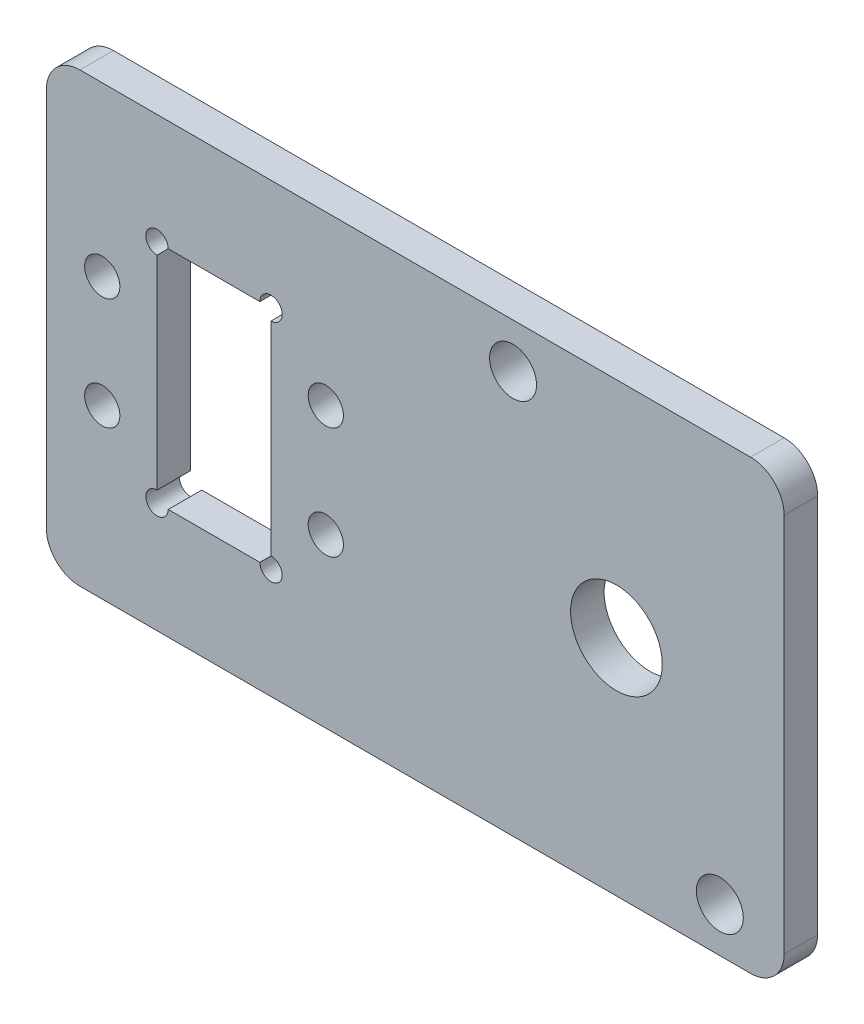
ISO-10303-21;
HEADER;
FILE_DESCRIPTION(('STEP AP214'),'2;1');
FILE_NAME('part.step','',(''),(''),'','','');
FILE_SCHEMA(('AUTOMOTIVE_DESIGN { 1 0 10303 214 1 1 1 1 }'));
ENDSEC;
DATA;
#1=APPLICATION_CONTEXT('core data for automotive mechanical design processes');
#2=APPLICATION_PROTOCOL_DEFINITION('international standard','automotive_design',2000,#1);
#3=PRODUCT_CONTEXT('',#1,'mechanical');
#4=PRODUCT('Part','Part','',(#3));
#5=PRODUCT_RELATED_PRODUCT_CATEGORY('part','',(#4));
#6=PRODUCT_DEFINITION_FORMATION('','',#4);
#7=PRODUCT_DEFINITION_CONTEXT('part definition',#1,'design');
#8=PRODUCT_DEFINITION('design','',#6,#7);
#9=PRODUCT_DEFINITION_SHAPE('','',#8);
#10=(LENGTH_UNIT() NAMED_UNIT(*) SI_UNIT(.MILLI.,.METRE.));
#11=(NAMED_UNIT(*) PLANE_ANGLE_UNIT() SI_UNIT($,.RADIAN.));
#12=(NAMED_UNIT(*) SI_UNIT($,.STERADIAN.) SOLID_ANGLE_UNIT());
#13=UNCERTAINTY_MEASURE_WITH_UNIT(LENGTH_MEASURE(1.E-05),#10,'distance_accuracy_value','');
#14=(GEOMETRIC_REPRESENTATION_CONTEXT(3) GLOBAL_UNCERTAINTY_ASSIGNED_CONTEXT((#13)) GLOBAL_UNIT_ASSIGNED_CONTEXT((#10,
#11,#12)) REPRESENTATION_CONTEXT('',''));
#15=CARTESIAN_POINT('',(0.,0.,0.));
#16=DIRECTION('',(0.,0.,1.));
#17=DIRECTION('',(1.,0.,0.));
#18=AXIS2_PLACEMENT_3D('',#15,#16,#17);
#19=CARTESIAN_POINT('',(0.,0.,3.));
#20=DIRECTION('',(-1.,0.,0.));
#21=DIRECTION('',(0.,-1.,0.));
#22=AXIS2_PLACEMENT_3D('',#19,#20,#21);
#23=PLANE('',#22);
#24=DIRECTION('',(0.,1.,0.));
#25=VECTOR('',#24,1.);
#26=CARTESIAN_POINT('',(0.,0.,3.));
#27=LINE('',#26,#25);
#28=CARTESIAN_POINT('',(0.,-37.,3.));
#29=VERTEX_POINT('',#28);
#30=CARTESIAN_POINT('',(0.,-3.,3.));
#31=VERTEX_POINT('',#30);
#32=EDGE_CURVE('E203',#29,#31,#27,.T.);
#33=ORIENTED_EDGE('',*,*,#32,.F.);
#34=DIRECTION('',(0.,0.,-1.));
#35=VECTOR('',#34,1.);
#36=CARTESIAN_POINT('',(0.,-37.,3.));
#37=LINE('',#36,#35);
#38=CARTESIAN_POINT('',(0.,-37.,0.));
#39=VERTEX_POINT('',#38);
#40=EDGE_CURVE('E11',#29,#39,#37,.T.);
#41=ORIENTED_EDGE('',*,*,#40,.T.);
#42=DIRECTION('',(0.,1.,0.));
#43=VECTOR('',#42,1.);
#44=CARTESIAN_POINT('',(0.,0.,0.));
#45=LINE('',#44,#43);
#46=CARTESIAN_POINT('',(0.,-3.,0.));
#47=VERTEX_POINT('',#46);
#48=EDGE_CURVE('E218',#39,#47,#45,.T.);
#49=ORIENTED_EDGE('',*,*,#48,.T.);
#50=DIRECTION('',(0.,0.,-1.));
#51=VECTOR('',#50,1.);
#52=CARTESIAN_POINT('',(0.,-3.,3.));
#53=LINE('',#52,#51);
#54=EDGE_CURVE('E52',#47,#31,#53,.F.);
#55=ORIENTED_EDGE('',*,*,#54,.T.);
#56=EDGE_LOOP('',(#33,#41,#49,#55));
#57=FACE_BOUND('',#56,.T.);
#58=ADVANCED_FACE('F43',(#57),#23,.F.);
#59=CARTESIAN_POINT('',(0.,0.,3.));
#60=DIRECTION('',(0.,-1.,0.));
#61=DIRECTION('',(1.,0.,0.));
#62=AXIS2_PLACEMENT_3D('',#59,#60,#61);
#63=PLANE('',#62);
#64=DIRECTION('',(-1.,0.,0.));
#65=VECTOR('',#64,1.);
#66=CARTESIAN_POINT('',(0.,0.,0.));
#67=LINE('',#66,#65);
#68=CARTESIAN_POINT('',(-3.,0.,0.));
#69=VERTEX_POINT('',#68);
#70=CARTESIAN_POINT('',(-63.,0.,0.));
#71=VERTEX_POINT('',#70);
#72=EDGE_CURVE('E222',#69,#71,#67,.T.);
#73=ORIENTED_EDGE('',*,*,#72,.T.);
#74=DIRECTION('',(0.,0.,-1.));
#75=VECTOR('',#74,1.);
#76=CARTESIAN_POINT('',(-63.,0.,3.));
#77=LINE('',#76,#75);
#78=CARTESIAN_POINT('',(-63.,0.,3.));
#79=VERTEX_POINT('',#78);
#80=EDGE_CURVE('E269',#71,#79,#77,.F.);
#81=ORIENTED_EDGE('',*,*,#80,.T.);
#82=DIRECTION('',(-1.,0.,0.));
#83=VECTOR('',#82,1.);
#84=CARTESIAN_POINT('',(0.,0.,3.));
#85=LINE('',#84,#83);
#86=CARTESIAN_POINT('',(-3.,0.,3.));
#87=VERTEX_POINT('',#86);
#88=EDGE_CURVE('E207',#87,#79,#85,.T.);
#89=ORIENTED_EDGE('',*,*,#88,.F.);
#90=DIRECTION('',(0.,0.,-1.));
#91=VECTOR('',#90,1.);
#92=CARTESIAN_POINT('',(-3.,0.,3.));
#93=LINE('',#92,#91);
#94=EDGE_CURVE('E265',#87,#69,#93,.T.);
#95=ORIENTED_EDGE('',*,*,#94,.T.);
#96=EDGE_LOOP('',(#73,#81,#89,#95));
#97=FACE_BOUND('',#96,.T.);
#98=ADVANCED_FACE('F301',(#97),#63,.F.);
#99=CARTESIAN_POINT('',(-66.,0.,3.));
#100=DIRECTION('',(1.,0.,0.));
#101=DIRECTION('',(0.,0.,-1.));
#102=AXIS2_PLACEMENT_3D('',#99,#100,#101);
#103=PLANE('',#102);
#104=DIRECTION('',(0.,-1.,0.));
#105=VECTOR('',#104,1.);
#106=CARTESIAN_POINT('',(-66.,0.,3.));
#107=LINE('',#106,#105);
#108=CARTESIAN_POINT('',(-66.,-3.00000000000001,3.));
#109=VERTEX_POINT('',#108);
#110=CARTESIAN_POINT('',(-66.,-37.,3.));
#111=VERTEX_POINT('',#110);
#112=EDGE_CURVE('E212',#109,#111,#107,.T.);
#113=ORIENTED_EDGE('',*,*,#112,.F.);
#114=DIRECTION('',(0.,0.,-1.));
#115=VECTOR('',#114,1.);
#116=CARTESIAN_POINT('',(-66.,-3.00000000000001,3.));
#117=LINE('',#116,#115);
#118=CARTESIAN_POINT('',(-66.,-3.00000000000001,0.));
#119=VERTEX_POINT('',#118);
#120=EDGE_CURVE('E249',#109,#119,#117,.T.);
#121=ORIENTED_EDGE('',*,*,#120,.T.);
#122=DIRECTION('',(0.,-1.,0.));
#123=VECTOR('',#122,1.);
#124=CARTESIAN_POINT('',(-66.,0.,0.));
#125=LINE('',#124,#123);
#126=CARTESIAN_POINT('',(-66.,-37.,0.));
#127=VERTEX_POINT('',#126);
#128=EDGE_CURVE('E227',#119,#127,#125,.T.);
#129=ORIENTED_EDGE('',*,*,#128,.T.);
#130=DIRECTION('',(0.,0.,-1.));
#131=VECTOR('',#130,1.);
#132=CARTESIAN_POINT('',(-66.,-37.,3.));
#133=LINE('',#132,#131);
#134=EDGE_CURVE('E246',#127,#111,#133,.F.);
#135=ORIENTED_EDGE('',*,*,#134,.T.);
#136=EDGE_LOOP('',(#113,#121,#129,#135));
#137=FACE_BOUND('',#136,.T.);
#138=ADVANCED_FACE('F312',(#137),#103,.F.);
#139=CARTESIAN_POINT('',(-66.,-40.,3.));
#140=DIRECTION('',(0.,1.,0.));
#141=DIRECTION('',(0.,0.,1.));
#142=AXIS2_PLACEMENT_3D('',#139,#140,#141);
#143=PLANE('',#142);
#144=DIRECTION('',(1.,0.,0.));
#145=VECTOR('',#144,1.);
#146=CARTESIAN_POINT('',(-66.,-40.,3.));
#147=LINE('',#146,#145);
#148=CARTESIAN_POINT('',(-63.,-40.,3.));
#149=VERTEX_POINT('',#148);
#150=CARTESIAN_POINT('',(-3.,-40.,3.));
#151=VERTEX_POINT('',#150);
#152=EDGE_CURVE('E215',#149,#151,#147,.T.);
#153=ORIENTED_EDGE('',*,*,#152,.F.);
#154=DIRECTION('',(0.,0.,-1.));
#155=VECTOR('',#154,1.);
#156=CARTESIAN_POINT('',(-63.,-40.,3.));
#157=LINE('',#156,#155);
#158=CARTESIAN_POINT('',(-63.,-40.,0.));
#159=VERTEX_POINT('',#158);
#160=EDGE_CURVE('E285',#149,#159,#157,.T.);
#161=ORIENTED_EDGE('',*,*,#160,.T.);
#162=DIRECTION('',(1.,0.,0.));
#163=VECTOR('',#162,1.);
#164=CARTESIAN_POINT('',(-66.,-40.,0.));
#165=LINE('',#164,#163);
#166=CARTESIAN_POINT('',(-3.,-40.,0.));
#167=VERTEX_POINT('',#166);
#168=EDGE_CURVE('E208',#159,#167,#165,.T.);
#169=ORIENTED_EDGE('',*,*,#168,.T.);
#170=DIRECTION('',(0.,0.,-1.));
#171=VECTOR('',#170,1.);
#172=CARTESIAN_POINT('',(-3.,-40.,3.));
#173=LINE('',#172,#171);
#174=EDGE_CURVE('E59',#167,#151,#173,.F.);
#175=ORIENTED_EDGE('',*,*,#174,.T.);
#176=EDGE_LOOP('',(#153,#161,#169,#175));
#177=FACE_BOUND('',#176,.T.);
#178=ADVANCED_FACE('F318',(#177),#143,.F.);
#179=CARTESIAN_POINT('',(0.,0.,3.));
#180=DIRECTION('',(0.,0.,1.));
#181=DIRECTION('',(1.,0.,0.));
#182=AXIS2_PLACEMENT_3D('',#179,#180,#181);
#183=PLANE('',#182);
#184=CARTESIAN_POINT('',(-56.1,-9.9,3.));
#185=DIRECTION('',(0.,0.,1.));
#186=DIRECTION('',(1.,0.,0.));
#187=AXIS2_PLACEMENT_3D('',#184,#185,#186);
#188=CIRCLE('',#187,0.999999999999998);
#189=CARTESIAN_POINT('',(-55.1,-9.9,3.));
#190=VERTEX_POINT('',#189);
#191=CARTESIAN_POINT('',(-56.1,-10.9,3.));
#192=VERTEX_POINT('',#191);
#193=EDGE_CURVE('E701',#190,#192,#188,.T.);
#194=ORIENTED_EDGE('',*,*,#193,.F.);
#195=DIRECTION('',(-1.,0.,0.));
#196=VECTOR('',#195,1.);
#197=CARTESIAN_POINT('',(-56.1,-9.9,3.));
#198=LINE('',#197,#196);
#199=CARTESIAN_POINT('',(-46.9,-9.9,3.));
#200=VERTEX_POINT('',#199);
#201=EDGE_CURVE('E191',#200,#190,#198,.T.);
#202=ORIENTED_EDGE('',*,*,#201,.F.);
#203=CARTESIAN_POINT('',(-45.9,-9.9,3.));
#204=DIRECTION('',(0.,0.,1.));
#205=DIRECTION('',(1.,0.,0.));
#206=AXIS2_PLACEMENT_3D('',#203,#204,#205);
#207=CIRCLE('',#206,0.999999999999998);
#208=CARTESIAN_POINT('',(-45.9,-10.9,3.));
#209=VERTEX_POINT('',#208);
#210=EDGE_CURVE('E170',#209,#200,#207,.T.);
#211=ORIENTED_EDGE('',*,*,#210,.F.);
#212=DIRECTION('',(0.,1.,0.));
#213=VECTOR('',#212,1.);
#214=CARTESIAN_POINT('',(-45.9,-9.9,3.));
#215=LINE('',#214,#213);
#216=CARTESIAN_POINT('',(-45.9,-29.1,3.));
#217=VERTEX_POINT('',#216);
#218=EDGE_CURVE('E178',#217,#209,#215,.T.);
#219=ORIENTED_EDGE('',*,*,#218,.F.);
#220=CARTESIAN_POINT('',(-45.9,-30.1,3.));
#221=DIRECTION('',(0.,0.,1.));
#222=DIRECTION('',(1.,0.,0.));
#223=AXIS2_PLACEMENT_3D('',#220,#221,#222);
#224=CIRCLE('',#223,0.999999999999998);
#225=CARTESIAN_POINT('',(-46.9,-30.1,3.));
#226=VERTEX_POINT('',#225);
#227=EDGE_CURVE('E158',#226,#217,#224,.T.);
#228=ORIENTED_EDGE('',*,*,#227,.F.);
#229=DIRECTION('',(1.,0.,0.));
#230=VECTOR('',#229,1.);
#231=CARTESIAN_POINT('',(-56.1,-30.1,3.));
#232=LINE('',#231,#230);
#233=CARTESIAN_POINT('',(-55.1,-30.1,3.));
#234=VERTEX_POINT('',#233);
#235=EDGE_CURVE('E192',#234,#226,#232,.T.);
#236=ORIENTED_EDGE('',*,*,#235,.F.);
#237=CARTESIAN_POINT('',(-56.1,-30.1,3.));
#238=DIRECTION('',(0.,0.,1.));
#239=DIRECTION('',(1.,0.,0.));
#240=AXIS2_PLACEMENT_3D('',#237,#238,#239);
#241=CIRCLE('',#240,0.999999999999998);
#242=CARTESIAN_POINT('',(-56.1,-29.1,3.));
#243=VERTEX_POINT('',#242);
#244=EDGE_CURVE('E597',#243,#234,#241,.T.);
#245=ORIENTED_EDGE('',*,*,#244,.F.);
#246=DIRECTION('',(0.,-1.,0.));
#247=VECTOR('',#246,1.);
#248=CARTESIAN_POINT('',(-56.1,-9.9,3.));
#249=LINE('',#248,#247);
#250=EDGE_CURVE('E199',#192,#243,#249,.T.);
#251=ORIENTED_EDGE('',*,*,#250,.F.);
#252=EDGE_LOOP('',(#194,#202,#211,#219,#228,#236,#245,#251));
#253=FACE_BOUND('',#252,.T.);
#254=CARTESIAN_POINT('',(-5.74999999999992,-36.0214699700121,3.));
#255=DIRECTION('',(0.,0.,1.));
#256=DIRECTION('',(1.,0.,0.));
#257=AXIS2_PLACEMENT_3D('',#254,#255,#256);
#258=CIRCLE('',#257,2.1);
#259=CARTESIAN_POINT('',(-3.64999999999992,-36.0214699700121,3.));
#260=VERTEX_POINT('',#259);
#261=EDGE_CURVE('E676',#260,#260,#258,.T.);
#262=ORIENTED_EDGE('',*,*,#261,.F.);
#263=EDGE_LOOP('',(#262));
#264=FACE_BOUND('',#263,.T.);
#265=CARTESIAN_POINT('',(-24.2500000000001,-3.97853002998793,3.));
#266=DIRECTION('',(0.,0.,1.));
#267=DIRECTION('',(1.,0.,0.));
#268=AXIS2_PLACEMENT_3D('',#265,#266,#267);
#269=CIRCLE('',#268,2.1);
#270=CARTESIAN_POINT('',(-22.1500000000001,-3.97853002998793,3.));
#271=VERTEX_POINT('',#270);
#272=EDGE_CURVE('E668',#271,#271,#269,.T.);
#273=ORIENTED_EDGE('',*,*,#272,.F.);
#274=EDGE_LOOP('',(#273));
#275=FACE_BOUND('',#274,.T.);
#276=CARTESIAN_POINT('',(-15.,-20.,3.));
#277=DIRECTION('',(0.,0.,1.));
#278=DIRECTION('',(1.,0.,0.));
#279=AXIS2_PLACEMENT_3D('',#276,#277,#278);
#280=CIRCLE('',#279,4.1);
#281=CARTESIAN_POINT('',(-10.9,-20.,3.));
#282=VERTEX_POINT('',#281);
#283=EDGE_CURVE('E660',#282,#282,#280,.T.);
#284=ORIENTED_EDGE('',*,*,#283,.F.);
#285=EDGE_LOOP('',(#284));
#286=FACE_BOUND('',#285,.T.);
#287=CARTESIAN_POINT('',(-41.,-15.,3.));
#288=DIRECTION('',(0.,0.,1.));
#289=DIRECTION('',(-1.,0.,0.));
#290=AXIS2_PLACEMENT_3D('',#287,#288,#289);
#291=CIRCLE('',#290,1.57500000000001);
#292=CARTESIAN_POINT('',(-42.575,-15.,3.));
#293=VERTEX_POINT('',#292);
#294=EDGE_CURVE('E652',#293,#293,#291,.T.);
#295=ORIENTED_EDGE('',*,*,#294,.F.);
#296=EDGE_LOOP('',(#295));
#297=FACE_BOUND('',#296,.T.);
#298=CARTESIAN_POINT('',(-41.,-25.,3.));
#299=DIRECTION('',(0.,0.,1.));
#300=DIRECTION('',(1.,0.,0.));
#301=AXIS2_PLACEMENT_3D('',#298,#299,#300);
#302=CIRCLE('',#301,1.57500000000001);
#303=CARTESIAN_POINT('',(-39.425,-25.,3.));
#304=VERTEX_POINT('',#303);
#305=EDGE_CURVE('E644',#304,#304,#302,.T.);
#306=ORIENTED_EDGE('',*,*,#305,.F.);
#307=EDGE_LOOP('',(#306));
#308=FACE_BOUND('',#307,.T.);
#309=CARTESIAN_POINT('',(-61.,-25.,3.));
#310=DIRECTION('',(0.,0.,1.));
#311=DIRECTION('',(-1.,0.,0.));
#312=AXIS2_PLACEMENT_3D('',#309,#310,#311);
#313=CIRCLE('',#312,1.57500000000001);
#314=CARTESIAN_POINT('',(-62.575,-25.,3.));
#315=VERTEX_POINT('',#314);
#316=EDGE_CURVE('E631',#315,#315,#313,.T.);
#317=ORIENTED_EDGE('',*,*,#316,.F.);
#318=EDGE_LOOP('',(#317));
#319=FACE_BOUND('',#318,.T.);
#320=CARTESIAN_POINT('',(-61.,-15.,3.));
#321=DIRECTION('',(0.,0.,1.));
#322=DIRECTION('',(1.,0.,0.));
#323=AXIS2_PLACEMENT_3D('',#320,#321,#322);
#324=CIRCLE('',#323,1.57500000000001);
#325=CARTESIAN_POINT('',(-59.425,-15.,3.));
#326=VERTEX_POINT('',#325);
#327=EDGE_CURVE('E621',#326,#326,#324,.T.);
#328=ORIENTED_EDGE('',*,*,#327,.F.);
#329=EDGE_LOOP('',(#328));
#330=FACE_BOUND('',#329,.T.);
#331=ORIENTED_EDGE('',*,*,#88,.T.);
#332=CARTESIAN_POINT('',(-63.,-3.00000000000001,3.));
#333=DIRECTION('',(0.,0.,1.));
#334=DIRECTION('',(1.,0.,0.));
#335=AXIS2_PLACEMENT_3D('',#332,#333,#334);
#336=CIRCLE('',#335,3.);
#337=EDGE_CURVE('E280',#79,#109,#336,.T.);
#338=ORIENTED_EDGE('',*,*,#337,.T.);
#339=ORIENTED_EDGE('',*,*,#112,.T.);
#340=CARTESIAN_POINT('',(-63.,-37.,3.));
#341=DIRECTION('',(0.,0.,1.));
#342=DIRECTION('',(1.,0.,0.));
#343=AXIS2_PLACEMENT_3D('',#340,#341,#342);
#344=CIRCLE('',#343,3.);
#345=EDGE_CURVE('E66',#111,#149,#344,.T.);
#346=ORIENTED_EDGE('',*,*,#345,.T.);
#347=ORIENTED_EDGE('',*,*,#152,.T.);
#348=CARTESIAN_POINT('',(-3.,-37.,3.));
#349=DIRECTION('',(0.,0.,1.));
#350=DIRECTION('',(1.,0.,0.));
#351=AXIS2_PLACEMENT_3D('',#348,#349,#350);
#352=CIRCLE('',#351,3.);
#353=EDGE_CURVE('E275',#151,#29,#352,.T.);
#354=ORIENTED_EDGE('',*,*,#353,.T.);
#355=ORIENTED_EDGE('',*,*,#32,.T.);
#356=CARTESIAN_POINT('',(-3.,-3.,3.));
#357=DIRECTION('',(0.,0.,1.));
#358=DIRECTION('',(1.,0.,0.));
#359=AXIS2_PLACEMENT_3D('',#356,#357,#358);
#360=CIRCLE('',#359,3.);
#361=EDGE_CURVE('E272',#31,#87,#360,.T.);
#362=ORIENTED_EDGE('',*,*,#361,.T.);
#363=EDGE_LOOP('',(#331,#338,#339,#346,#347,#354,#355,#362));
#364=FACE_BOUND('',#363,.T.);
#365=ADVANCED_FACE('F187',(#253,#264,#275,#286,#297,#308,#319,#330,#364),#183,.T.);
#366=CARTESIAN_POINT('',(0.,0.,0.));
#367=DIRECTION('',(0.,0.,1.));
#368=DIRECTION('',(1.,0.,0.));
#369=AXIS2_PLACEMENT_3D('',#366,#367,#368);
#370=PLANE('',#369);
#371=CARTESIAN_POINT('',(-5.74999999999992,-36.0214699700121,0.));
#372=DIRECTION('',(0.,0.,1.));
#373=DIRECTION('',(1.,0.,0.));
#374=AXIS2_PLACEMENT_3D('',#371,#372,#373);
#375=CIRCLE('',#374,2.1);
#376=CARTESIAN_POINT('',(-3.64999999999992,-36.0214699700121,0.));
#377=VERTEX_POINT('',#376);
#378=EDGE_CURVE('E679',#377,#377,#375,.T.);
#379=ORIENTED_EDGE('',*,*,#378,.T.);
#380=EDGE_LOOP('',(#379));
#381=FACE_BOUND('',#380,.T.);
#382=CARTESIAN_POINT('',(-24.2500000000001,-3.97853002998793,0.));
#383=DIRECTION('',(0.,0.,1.));
#384=DIRECTION('',(1.,0.,0.));
#385=AXIS2_PLACEMENT_3D('',#382,#383,#384);
#386=CIRCLE('',#385,2.1);
#387=CARTESIAN_POINT('',(-22.1500000000001,-3.97853002998793,0.));
#388=VERTEX_POINT('',#387);
#389=EDGE_CURVE('E672',#388,#388,#386,.T.);
#390=ORIENTED_EDGE('',*,*,#389,.T.);
#391=EDGE_LOOP('',(#390));
#392=FACE_BOUND('',#391,.T.);
#393=CARTESIAN_POINT('',(-15.,-20.,0.));
#394=DIRECTION('',(0.,0.,1.));
#395=DIRECTION('',(1.,0.,0.));
#396=AXIS2_PLACEMENT_3D('',#393,#394,#395);
#397=CIRCLE('',#396,4.1);
#398=CARTESIAN_POINT('',(-10.9,-20.,0.));
#399=VERTEX_POINT('',#398);
#400=EDGE_CURVE('E664',#399,#399,#397,.T.);
#401=ORIENTED_EDGE('',*,*,#400,.T.);
#402=EDGE_LOOP('',(#401));
#403=FACE_BOUND('',#402,.T.);
#404=CARTESIAN_POINT('',(-41.,-15.,0.));
#405=DIRECTION('',(0.,0.,1.));
#406=DIRECTION('',(-1.,0.,0.));
#407=AXIS2_PLACEMENT_3D('',#404,#405,#406);
#408=CIRCLE('',#407,1.57500000000001);
#409=CARTESIAN_POINT('',(-42.575,-15.,0.));
#410=VERTEX_POINT('',#409);
#411=EDGE_CURVE('E656',#410,#410,#408,.T.);
#412=ORIENTED_EDGE('',*,*,#411,.T.);
#413=EDGE_LOOP('',(#412));
#414=FACE_BOUND('',#413,.T.);
#415=CARTESIAN_POINT('',(-41.,-25.,0.));
#416=DIRECTION('',(0.,0.,1.));
#417=DIRECTION('',(1.,0.,0.));
#418=AXIS2_PLACEMENT_3D('',#415,#416,#417);
#419=CIRCLE('',#418,1.57500000000001);
#420=CARTESIAN_POINT('',(-39.425,-25.,0.));
#421=VERTEX_POINT('',#420);
#422=EDGE_CURVE('E648',#421,#421,#419,.T.);
#423=ORIENTED_EDGE('',*,*,#422,.T.);
#424=EDGE_LOOP('',(#423));
#425=FACE_BOUND('',#424,.T.);
#426=CARTESIAN_POINT('',(-61.,-25.,0.));
#427=DIRECTION('',(0.,0.,1.));
#428=DIRECTION('',(-1.,0.,0.));
#429=AXIS2_PLACEMENT_3D('',#426,#427,#428);
#430=CIRCLE('',#429,1.57500000000001);
#431=CARTESIAN_POINT('',(-62.575,-25.,0.));
#432=VERTEX_POINT('',#431);
#433=EDGE_CURVE('E640',#432,#432,#430,.T.);
#434=ORIENTED_EDGE('',*,*,#433,.T.);
#435=EDGE_LOOP('',(#434));
#436=FACE_BOUND('',#435,.T.);
#437=CARTESIAN_POINT('',(-61.,-15.,0.));
#438=DIRECTION('',(0.,0.,1.));
#439=DIRECTION('',(1.,0.,0.));
#440=AXIS2_PLACEMENT_3D('',#437,#438,#439);
#441=CIRCLE('',#440,1.57500000000001);
#442=CARTESIAN_POINT('',(-59.425,-15.,0.));
#443=VERTEX_POINT('',#442);
#444=EDGE_CURVE('E625',#443,#443,#441,.T.);
#445=ORIENTED_EDGE('',*,*,#444,.T.);
#446=EDGE_LOOP('',(#445));
#447=FACE_BOUND('',#446,.T.);
#448=DIRECTION('',(-1.,0.,0.));
#449=VECTOR('',#448,1.);
#450=CARTESIAN_POINT('',(-56.1,-9.9,0.));
#451=LINE('',#450,#449);
#452=CARTESIAN_POINT('',(-46.9,-9.9,0.));
#453=VERTEX_POINT('',#452);
#454=CARTESIAN_POINT('',(-55.1,-9.9,0.));
#455=VERTEX_POINT('',#454);
#456=EDGE_CURVE('E223',#453,#455,#451,.T.);
#457=ORIENTED_EDGE('',*,*,#456,.T.);
#458=CARTESIAN_POINT('',(-56.1,-9.9,0.));
#459=DIRECTION('',(0.,0.,1.));
#460=DIRECTION('',(1.,0.,0.));
#461=AXIS2_PLACEMENT_3D('',#458,#459,#460);
#462=CIRCLE('',#461,0.999999999999998);
#463=CARTESIAN_POINT('',(-56.1,-10.9,0.));
#464=VERTEX_POINT('',#463);
#465=EDGE_CURVE('E697',#455,#464,#462,.T.);
#466=ORIENTED_EDGE('',*,*,#465,.T.);
#467=DIRECTION('',(0.,-1.,0.));
#468=VECTOR('',#467,1.);
#469=CARTESIAN_POINT('',(-56.1,-9.9,0.));
#470=LINE('',#469,#468);
#471=CARTESIAN_POINT('',(-56.1,-29.1,0.));
#472=VERTEX_POINT('',#471);
#473=EDGE_CURVE('E197',#464,#472,#470,.T.);
#474=ORIENTED_EDGE('',*,*,#473,.T.);
#475=CARTESIAN_POINT('',(-56.1,-30.1,0.));
#476=DIRECTION('',(0.,0.,1.));
#477=DIRECTION('',(1.,0.,0.));
#478=AXIS2_PLACEMENT_3D('',#475,#476,#477);
#479=CIRCLE('',#478,0.999999999999998);
#480=CARTESIAN_POINT('',(-55.1,-30.1,0.));
#481=VERTEX_POINT('',#480);
#482=EDGE_CURVE('E603',#472,#481,#479,.T.);
#483=ORIENTED_EDGE('',*,*,#482,.T.);
#484=DIRECTION('',(1.,0.,0.));
#485=VECTOR('',#484,1.);
#486=CARTESIAN_POINT('',(-56.1,-30.1,0.));
#487=LINE('',#486,#485);
#488=CARTESIAN_POINT('',(-46.9,-30.1,0.));
#489=VERTEX_POINT('',#488);
#490=EDGE_CURVE('E607',#481,#489,#487,.T.);
#491=ORIENTED_EDGE('',*,*,#490,.T.);
#492=CARTESIAN_POINT('',(-45.9,-30.1,0.));
#493=DIRECTION('',(0.,0.,1.));
#494=DIRECTION('',(1.,0.,0.));
#495=AXIS2_PLACEMENT_3D('',#492,#493,#494);
#496=CIRCLE('',#495,0.999999999999998);
#497=CARTESIAN_POINT('',(-45.9,-29.1,0.));
#498=VERTEX_POINT('',#497);
#499=EDGE_CURVE('E171',#489,#498,#496,.T.);
#500=ORIENTED_EDGE('',*,*,#499,.T.);
#501=DIRECTION('',(0.,1.,0.));
#502=VECTOR('',#501,1.);
#503=CARTESIAN_POINT('',(-45.9,-9.9,0.));
#504=LINE('',#503,#502);
#505=CARTESIAN_POINT('',(-45.9,-10.9,0.));
#506=VERTEX_POINT('',#505);
#507=EDGE_CURVE('E180',#498,#506,#504,.T.);
#508=ORIENTED_EDGE('',*,*,#507,.T.);
#509=CARTESIAN_POINT('',(-45.9,-9.9,0.));
#510=DIRECTION('',(0.,0.,1.));
#511=DIRECTION('',(1.,0.,0.));
#512=AXIS2_PLACEMENT_3D('',#509,#510,#511);
#513=CIRCLE('',#512,0.999999999999998);
#514=EDGE_CURVE('E183',#506,#453,#513,.T.);
#515=ORIENTED_EDGE('',*,*,#514,.T.);
#516=EDGE_LOOP('',(#457,#466,#474,#483,#491,#500,#508,#515));
#517=FACE_BOUND('',#516,.T.);
#518=ORIENTED_EDGE('',*,*,#128,.F.);
#519=CARTESIAN_POINT('',(-63.,-3.00000000000001,0.));
#520=DIRECTION('',(0.,0.,1.));
#521=DIRECTION('',(1.,0.,0.));
#522=AXIS2_PLACEMENT_3D('',#519,#520,#521);
#523=CIRCLE('',#522,3.);
#524=EDGE_CURVE('E262',#119,#71,#523,.F.);
#525=ORIENTED_EDGE('',*,*,#524,.T.);
#526=ORIENTED_EDGE('',*,*,#72,.F.);
#527=CARTESIAN_POINT('',(-3.,-3.,0.));
#528=DIRECTION('',(0.,0.,1.));
#529=DIRECTION('',(1.,0.,0.));
#530=AXIS2_PLACEMENT_3D('',#527,#528,#529);
#531=CIRCLE('',#530,3.);
#532=EDGE_CURVE('E253',#69,#47,#531,.F.);
#533=ORIENTED_EDGE('',*,*,#532,.T.);
#534=ORIENTED_EDGE('',*,*,#48,.F.);
#535=CARTESIAN_POINT('',(-3.,-37.,0.));
#536=DIRECTION('',(0.,0.,1.));
#537=DIRECTION('',(1.,0.,0.));
#538=AXIS2_PLACEMENT_3D('',#535,#536,#537);
#539=CIRCLE('',#538,3.);
#540=EDGE_CURVE('E256',#39,#167,#539,.F.);
#541=ORIENTED_EDGE('',*,*,#540,.T.);
#542=ORIENTED_EDGE('',*,*,#168,.F.);
#543=CARTESIAN_POINT('',(-63.,-37.,0.));
#544=DIRECTION('',(0.,0.,1.));
#545=DIRECTION('',(1.,0.,0.));
#546=AXIS2_PLACEMENT_3D('',#543,#544,#545);
#547=CIRCLE('',#546,3.);
#548=EDGE_CURVE('E259',#159,#127,#547,.F.);
#549=ORIENTED_EDGE('',*,*,#548,.T.);
#550=EDGE_LOOP('',(#518,#525,#526,#533,#534,#541,#542,#549));
#551=FACE_BOUND('',#550,.T.);
#552=ADVANCED_FACE('F305',(#381,#392,#403,#414,#425,#436,#447,#517,#551),#370,.F.);
#553=CARTESIAN_POINT('',(-56.1,-9.9,0.));
#554=DIRECTION('',(-1.,0.,0.));
#555=DIRECTION('',(0.,-1.,0.));
#556=AXIS2_PLACEMENT_3D('',#553,#554,#555);
#557=PLANE('',#556);
#558=ORIENTED_EDGE('',*,*,#473,.F.);
#559=DIRECTION('',(0.,0.,1.));
#560=VECTOR('',#559,1.);
#561=CARTESIAN_POINT('',(-56.1,-10.9,0.));
#562=LINE('',#561,#560);
#563=EDGE_CURVE('E634',#464,#192,#562,.T.);
#564=ORIENTED_EDGE('',*,*,#563,.T.);
#565=ORIENTED_EDGE('',*,*,#250,.T.);
#566=DIRECTION('',(0.,0.,1.));
#567=VECTOR('',#566,1.);
#568=CARTESIAN_POINT('',(-56.1,-29.1,0.));
#569=LINE('',#568,#567);
#570=EDGE_CURVE('E182',#243,#472,#569,.F.);
#571=ORIENTED_EDGE('',*,*,#570,.T.);
#572=EDGE_LOOP('',(#558,#564,#565,#571));
#573=FACE_BOUND('',#572,.T.);
#574=ADVANCED_FACE('F384',(#573),#557,.F.);
#575=CARTESIAN_POINT('',(-56.1,-9.9,0.));
#576=DIRECTION('',(0.,1.,0.));
#577=DIRECTION('',(-1.,0.,0.));
#578=AXIS2_PLACEMENT_3D('',#575,#576,#577);
#579=PLANE('',#578);
#580=ORIENTED_EDGE('',*,*,#201,.T.);
#581=DIRECTION('',(0.,0.,1.));
#582=VECTOR('',#581,1.);
#583=CARTESIAN_POINT('',(-55.1,-9.9,0.));
#584=LINE('',#583,#582);
#585=EDGE_CURVE('E242',#190,#455,#584,.F.);
#586=ORIENTED_EDGE('',*,*,#585,.T.);
#587=ORIENTED_EDGE('',*,*,#456,.F.);
#588=DIRECTION('',(0.,0.,1.));
#589=VECTOR('',#588,1.);
#590=CARTESIAN_POINT('',(-46.9,-9.9,0.));
#591=LINE('',#590,#589);
#592=EDGE_CURVE('E684',#453,#200,#591,.T.);
#593=ORIENTED_EDGE('',*,*,#592,.T.);
#594=EDGE_LOOP('',(#580,#586,#587,#593));
#595=FACE_BOUND('',#594,.T.);
#596=ADVANCED_FACE('F381',(#595),#579,.F.);
#597=CARTESIAN_POINT('',(-45.9,-9.9,0.));
#598=DIRECTION('',(1.,0.,0.));
#599=DIRECTION('',(0.,0.,-1.));
#600=AXIS2_PLACEMENT_3D('',#597,#598,#599);
#601=PLANE('',#600);
#602=ORIENTED_EDGE('',*,*,#507,.F.);
#603=DIRECTION('',(0.,0.,1.));
#604=VECTOR('',#603,1.);
#605=CARTESIAN_POINT('',(-45.9,-29.1,0.));
#606=LINE('',#605,#604);
#607=EDGE_CURVE('E161',#498,#217,#606,.T.);
#608=ORIENTED_EDGE('',*,*,#607,.T.);
#609=ORIENTED_EDGE('',*,*,#218,.T.);
#610=DIRECTION('',(0.,0.,1.));
#611=VECTOR('',#610,1.);
#612=CARTESIAN_POINT('',(-45.9,-10.9,0.));
#613=LINE('',#612,#611);
#614=EDGE_CURVE('E239',#209,#506,#613,.F.);
#615=ORIENTED_EDGE('',*,*,#614,.T.);
#616=EDGE_LOOP('',(#602,#608,#609,#615));
#617=FACE_BOUND('',#616,.T.);
#618=ADVANCED_FACE('F176',(#617),#601,.F.);
#619=CARTESIAN_POINT('',(-56.1,-30.1,0.));
#620=DIRECTION('',(0.,-1.,0.));
#621=DIRECTION('',(0.,0.,-1.));
#622=AXIS2_PLACEMENT_3D('',#619,#620,#621);
#623=PLANE('',#622);
#624=ORIENTED_EDGE('',*,*,#490,.F.);
#625=DIRECTION('',(0.,0.,1.));
#626=VECTOR('',#625,1.);
#627=CARTESIAN_POINT('',(-55.1,-30.1,0.));
#628=LINE('',#627,#626);
#629=EDGE_CURVE('E235',#481,#234,#628,.T.);
#630=ORIENTED_EDGE('',*,*,#629,.T.);
#631=ORIENTED_EDGE('',*,*,#235,.T.);
#632=DIRECTION('',(0.,0.,1.));
#633=VECTOR('',#632,1.);
#634=CARTESIAN_POINT('',(-46.9,-30.1,0.));
#635=LINE('',#634,#633);
#636=EDGE_CURVE('E164',#226,#489,#635,.F.);
#637=ORIENTED_EDGE('',*,*,#636,.T.);
#638=EDGE_LOOP('',(#624,#630,#631,#637));
#639=FACE_BOUND('',#638,.T.);
#640=ADVANCED_FACE('F356',(#639),#623,.F.);
#641=CARTESIAN_POINT('',(-61.,-15.,0.));
#642=DIRECTION('',(0.,0.,1.));
#643=DIRECTION('',(1.,0.,0.));
#644=AXIS2_PLACEMENT_3D('',#641,#642,#643);
#645=CYLINDRICAL_SURFACE('',#644,1.57500000000001);
#646=ORIENTED_EDGE('',*,*,#444,.F.);
#647=EDGE_LOOP('',(#646));
#648=FACE_BOUND('',#647,.T.);
#649=ORIENTED_EDGE('',*,*,#327,.T.);
#650=EDGE_LOOP('',(#649));
#651=FACE_BOUND('',#650,.T.);
#652=ADVANCED_FACE('F352',(#648,#651),#645,.F.);
#653=CARTESIAN_POINT('',(-61.,-25.,0.));
#654=DIRECTION('',(0.,0.,1.));
#655=DIRECTION('',(1.,0.,0.));
#656=AXIS2_PLACEMENT_3D('',#653,#654,#655);
#657=CYLINDRICAL_SURFACE('',#656,1.57500000000001);
#658=ORIENTED_EDGE('',*,*,#433,.F.);
#659=EDGE_LOOP('',(#658));
#660=FACE_BOUND('',#659,.T.);
#661=ORIENTED_EDGE('',*,*,#316,.T.);
#662=EDGE_LOOP('',(#661));
#663=FACE_BOUND('',#662,.T.);
#664=ADVANCED_FACE('F355',(#660,#663),#657,.F.);
#665=CARTESIAN_POINT('',(-41.,-25.,0.));
#666=DIRECTION('',(0.,0.,1.));
#667=DIRECTION('',(1.,0.,0.));
#668=AXIS2_PLACEMENT_3D('',#665,#666,#667);
#669=CYLINDRICAL_SURFACE('',#668,1.57500000000001);
#670=ORIENTED_EDGE('',*,*,#422,.F.);
#671=EDGE_LOOP('',(#670));
#672=FACE_BOUND('',#671,.T.);
#673=ORIENTED_EDGE('',*,*,#305,.T.);
#674=EDGE_LOOP('',(#673));
#675=FACE_BOUND('',#674,.T.);
#676=ADVANCED_FACE('F360',(#672,#675),#669,.F.);
#677=CARTESIAN_POINT('',(-41.,-15.,0.));
#678=DIRECTION('',(0.,0.,1.));
#679=DIRECTION('',(1.,0.,0.));
#680=AXIS2_PLACEMENT_3D('',#677,#678,#679);
#681=CYLINDRICAL_SURFACE('',#680,1.57500000000001);
#682=ORIENTED_EDGE('',*,*,#411,.F.);
#683=EDGE_LOOP('',(#682));
#684=FACE_BOUND('',#683,.T.);
#685=ORIENTED_EDGE('',*,*,#294,.T.);
#686=EDGE_LOOP('',(#685));
#687=FACE_BOUND('',#686,.T.);
#688=ADVANCED_FACE('F364',(#684,#687),#681,.F.);
#689=CARTESIAN_POINT('',(-15.,-20.,0.));
#690=DIRECTION('',(0.,0.,1.));
#691=DIRECTION('',(1.,0.,0.));
#692=AXIS2_PLACEMENT_3D('',#689,#690,#691);
#693=CYLINDRICAL_SURFACE('',#692,4.1);
#694=ORIENTED_EDGE('',*,*,#400,.F.);
#695=EDGE_LOOP('',(#694));
#696=FACE_BOUND('',#695,.T.);
#697=ORIENTED_EDGE('',*,*,#283,.T.);
#698=EDGE_LOOP('',(#697));
#699=FACE_BOUND('',#698,.T.);
#700=ADVANCED_FACE('F368',(#696,#699),#693,.F.);
#701=CARTESIAN_POINT('',(-24.2500000000001,-3.97853002998793,0.));
#702=DIRECTION('',(0.,0.,1.));
#703=DIRECTION('',(1.,0.,0.));
#704=AXIS2_PLACEMENT_3D('',#701,#702,#703);
#705=CYLINDRICAL_SURFACE('',#704,2.1);
#706=ORIENTED_EDGE('',*,*,#389,.F.);
#707=EDGE_LOOP('',(#706));
#708=FACE_BOUND('',#707,.T.);
#709=ORIENTED_EDGE('',*,*,#272,.T.);
#710=EDGE_LOOP('',(#709));
#711=FACE_BOUND('',#710,.T.);
#712=ADVANCED_FACE('F372',(#708,#711),#705,.F.);
#713=CARTESIAN_POINT('',(-5.74999999999992,-36.0214699700121,0.));
#714=DIRECTION('',(0.,0.,1.));
#715=DIRECTION('',(1.,0.,0.));
#716=AXIS2_PLACEMENT_3D('',#713,#714,#715);
#717=CYLINDRICAL_SURFACE('',#716,2.1);
#718=ORIENTED_EDGE('',*,*,#378,.F.);
#719=EDGE_LOOP('',(#718));
#720=FACE_BOUND('',#719,.T.);
#721=ORIENTED_EDGE('',*,*,#261,.T.);
#722=EDGE_LOOP('',(#721));
#723=FACE_BOUND('',#722,.T.);
#724=ADVANCED_FACE('F376',(#720,#723),#717,.F.);
#725=CARTESIAN_POINT('',(-45.9,-30.1,0.));
#726=DIRECTION('',(0.,0.,1.));
#727=DIRECTION('',(1.,0.,0.));
#728=AXIS2_PLACEMENT_3D('',#725,#726,#727);
#729=CYLINDRICAL_SURFACE('',#728,0.999999999999998);
#730=ORIENTED_EDGE('',*,*,#499,.F.);
#731=ORIENTED_EDGE('',*,*,#636,.F.);
#732=ORIENTED_EDGE('',*,*,#227,.T.);
#733=ORIENTED_EDGE('',*,*,#607,.F.);
#734=EDGE_LOOP('',(#730,#731,#732,#733));
#735=FACE_BOUND('',#734,.T.);
#736=ADVANCED_FACE('F160',(#735),#729,.F.);
#737=CARTESIAN_POINT('',(-56.1,-30.1,0.));
#738=DIRECTION('',(0.,0.,1.));
#739=DIRECTION('',(1.,0.,0.));
#740=AXIS2_PLACEMENT_3D('',#737,#738,#739);
#741=CYLINDRICAL_SURFACE('',#740,0.999999999999998);
#742=ORIENTED_EDGE('',*,*,#244,.T.);
#743=ORIENTED_EDGE('',*,*,#629,.F.);
#744=ORIENTED_EDGE('',*,*,#482,.F.);
#745=ORIENTED_EDGE('',*,*,#570,.F.);
#746=EDGE_LOOP('',(#742,#743,#744,#745));
#747=FACE_BOUND('',#746,.T.);
#748=ADVANCED_FACE('F346',(#747),#741,.F.);
#749=CARTESIAN_POINT('',(-45.9,-9.9,0.));
#750=DIRECTION('',(0.,0.,1.));
#751=DIRECTION('',(1.,0.,0.));
#752=AXIS2_PLACEMENT_3D('',#749,#750,#751);
#753=CYLINDRICAL_SURFACE('',#752,0.999999999999998);
#754=ORIENTED_EDGE('',*,*,#514,.F.);
#755=ORIENTED_EDGE('',*,*,#614,.F.);
#756=ORIENTED_EDGE('',*,*,#210,.T.);
#757=ORIENTED_EDGE('',*,*,#592,.F.);
#758=EDGE_LOOP('',(#754,#755,#756,#757));
#759=FACE_BOUND('',#758,.T.);
#760=ADVANCED_FACE('F340',(#759),#753,.F.);
#761=CARTESIAN_POINT('',(-56.1,-9.9,0.));
#762=DIRECTION('',(0.,0.,1.));
#763=DIRECTION('',(1.,0.,0.));
#764=AXIS2_PLACEMENT_3D('',#761,#762,#763);
#765=CYLINDRICAL_SURFACE('',#764,0.999999999999998);
#766=ORIENTED_EDGE('',*,*,#465,.F.);
#767=ORIENTED_EDGE('',*,*,#585,.F.);
#768=ORIENTED_EDGE('',*,*,#193,.T.);
#769=ORIENTED_EDGE('',*,*,#563,.F.);
#770=EDGE_LOOP('',(#766,#767,#768,#769));
#771=FACE_BOUND('',#770,.T.);
#772=ADVANCED_FACE('F336',(#771),#765,.F.);
#773=CARTESIAN_POINT('',(-63.,-3.00000000000001,3.));
#774=DIRECTION('',(0.,0.,-1.));
#775=DIRECTION('',(-1.,0.,0.));
#776=AXIS2_PLACEMENT_3D('',#773,#774,#775);
#777=CYLINDRICAL_SURFACE('',#776,3.);
#778=ORIENTED_EDGE('',*,*,#337,.F.);
#779=ORIENTED_EDGE('',*,*,#80,.F.);
#780=ORIENTED_EDGE('',*,*,#524,.F.);
#781=ORIENTED_EDGE('',*,*,#120,.F.);
#782=EDGE_LOOP('',(#778,#779,#780,#781));
#783=FACE_BOUND('',#782,.T.);
#784=ADVANCED_FACE('F309',(#783),#777,.T.);
#785=CARTESIAN_POINT('',(-63.,-37.,3.));
#786=DIRECTION('',(0.,0.,-1.));
#787=DIRECTION('',(-1.,0.,0.));
#788=AXIS2_PLACEMENT_3D('',#785,#786,#787);
#789=CYLINDRICAL_SURFACE('',#788,3.);
#790=ORIENTED_EDGE('',*,*,#345,.F.);
#791=ORIENTED_EDGE('',*,*,#134,.F.);
#792=ORIENTED_EDGE('',*,*,#548,.F.);
#793=ORIENTED_EDGE('',*,*,#160,.F.);
#794=EDGE_LOOP('',(#790,#791,#792,#793));
#795=FACE_BOUND('',#794,.T.);
#796=ADVANCED_FACE('F316',(#795),#789,.T.);
#797=CARTESIAN_POINT('',(-3.,-37.,3.));
#798=DIRECTION('',(0.,0.,-1.));
#799=DIRECTION('',(-1.,0.,0.));
#800=AXIS2_PLACEMENT_3D('',#797,#798,#799);
#801=CYLINDRICAL_SURFACE('',#800,3.);
#802=ORIENTED_EDGE('',*,*,#353,.F.);
#803=ORIENTED_EDGE('',*,*,#174,.F.);
#804=ORIENTED_EDGE('',*,*,#540,.F.);
#805=ORIENTED_EDGE('',*,*,#40,.F.);
#806=EDGE_LOOP('',(#802,#803,#804,#805));
#807=FACE_BOUND('',#806,.T.);
#808=ADVANCED_FACE('F320',(#807),#801,.T.);
#809=CARTESIAN_POINT('',(-3.,-3.,3.));
#810=DIRECTION('',(0.,0.,-1.));
#811=DIRECTION('',(-1.,0.,0.));
#812=AXIS2_PLACEMENT_3D('',#809,#810,#811);
#813=CYLINDRICAL_SURFACE('',#812,3.);
#814=ORIENTED_EDGE('',*,*,#361,.F.);
#815=ORIENTED_EDGE('',*,*,#54,.F.);
#816=ORIENTED_EDGE('',*,*,#532,.F.);
#817=ORIENTED_EDGE('',*,*,#94,.F.);
#818=EDGE_LOOP('',(#814,#815,#816,#817));
#819=FACE_BOUND('',#818,.T.);
#820=ADVANCED_FACE('F45',(#819),#813,.T.);
#821=CLOSED_SHELL('',(#58,#98,#138,#178,#365,#552,#574,#596,#618,#640,#652,#664,#676,#688,#700,
#712,#724,#736,#748,#760,#772,#784,#796,#808,#820));
#822=MANIFOLD_SOLID_BREP('B2',#821);
#823=ADVANCED_BREP_SHAPE_REPRESENTATION('',(#18,#822),#14);
#824=SHAPE_DEFINITION_REPRESENTATION(#9,#823);
ENDSEC;
END-ISO-10303-21;
